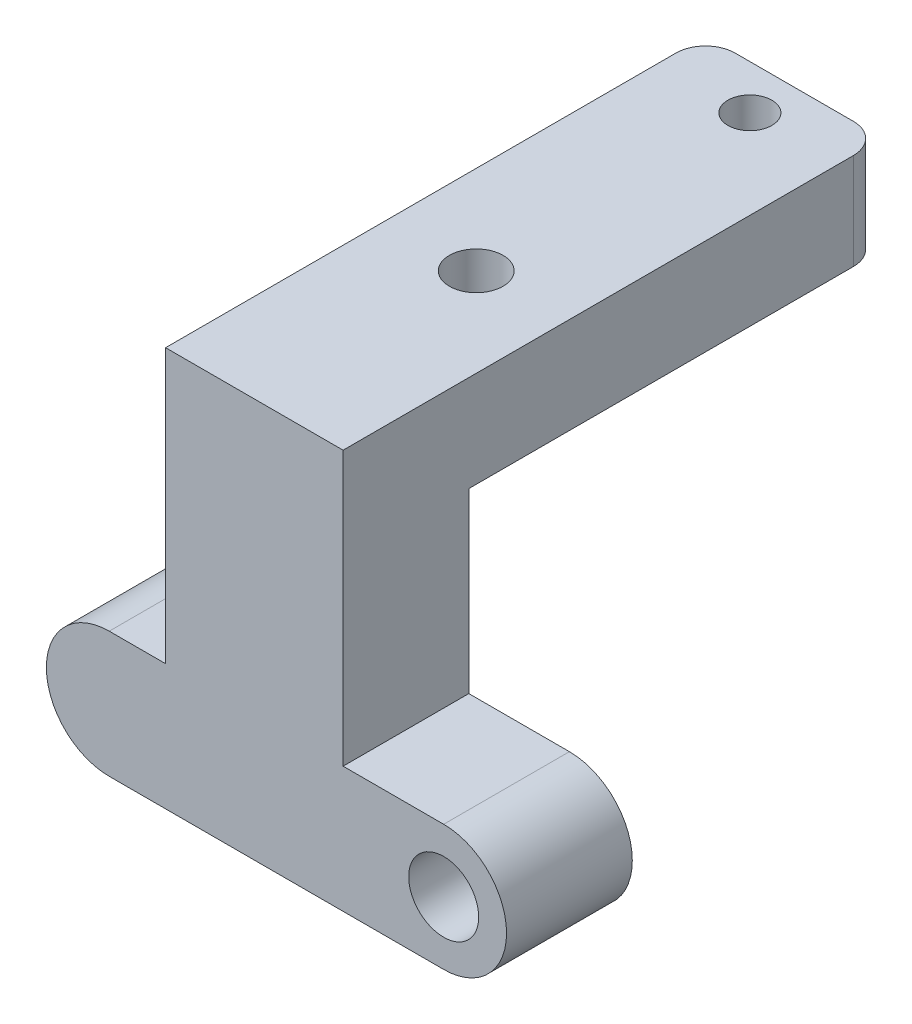
ISO-10303-21;
HEADER;
FILE_DESCRIPTION(('STEP AP214'),'2;1');
FILE_NAME('part.step','',(''),(''),'','','');
FILE_SCHEMA(('AUTOMOTIVE_DESIGN { 1 0 10303 214 1 1 1 1 }'));
ENDSEC;
DATA;
#1=APPLICATION_CONTEXT('core data for automotive mechanical design processes');
#2=APPLICATION_PROTOCOL_DEFINITION('international standard','automotive_design',2000,#1);
#3=PRODUCT_CONTEXT('',#1,'mechanical');
#4=PRODUCT('Part','Part','',(#3));
#5=PRODUCT_RELATED_PRODUCT_CATEGORY('part','',(#4));
#6=PRODUCT_DEFINITION_FORMATION('','',#4);
#7=PRODUCT_DEFINITION_CONTEXT('part definition',#1,'design');
#8=PRODUCT_DEFINITION('design','',#6,#7);
#9=PRODUCT_DEFINITION_SHAPE('','',#8);
#10=(LENGTH_UNIT() NAMED_UNIT(*) SI_UNIT(.MILLI.,.METRE.));
#11=(NAMED_UNIT(*) PLANE_ANGLE_UNIT() SI_UNIT($,.RADIAN.));
#12=(NAMED_UNIT(*) SI_UNIT($,.STERADIAN.) SOLID_ANGLE_UNIT());
#13=UNCERTAINTY_MEASURE_WITH_UNIT(LENGTH_MEASURE(1.E-05),#10,'distance_accuracy_value','');
#14=(GEOMETRIC_REPRESENTATION_CONTEXT(3) GLOBAL_UNCERTAINTY_ASSIGNED_CONTEXT((#13)) GLOBAL_UNIT_ASSIGNED_CONTEXT((#10,
#11,#12)) REPRESENTATION_CONTEXT('',''));
#15=CARTESIAN_POINT('',(0.,0.,0.));
#16=DIRECTION('',(0.,0.,1.));
#17=DIRECTION('',(1.,0.,0.));
#18=AXIS2_PLACEMENT_3D('',#15,#16,#17);
#19=CARTESIAN_POINT('',(4.03216256355221,0.,-8.5));
#20=DIRECTION('',(1.,0.,0.));
#21=DIRECTION('',(0.,0.,-1.));
#22=AXIS2_PLACEMENT_3D('',#19,#20,#21);
#23=PLANE('',#22);
#24=DIRECTION('',(0.,0.,1.));
#25=VECTOR('',#24,1.);
#26=CARTESIAN_POINT('',(4.03216256355221,16.25,-36.5));
#27=LINE('',#26,#25);
#28=CARTESIAN_POINT('',(4.03216256355221,16.25,-34.5));
#29=VERTEX_POINT('',#28);
#30=CARTESIAN_POINT('',(4.03216256355221,16.25,-8.5));
#31=VERTEX_POINT('',#30);
#32=EDGE_CURVE('E131',#29,#31,#27,.T.);
#33=ORIENTED_EDGE('',*,*,#32,.F.);
#34=DIRECTION('',(0.,1.,0.));
#35=VECTOR('',#34,1.);
#36=CARTESIAN_POINT('',(4.03216256355221,0.,-34.5));
#37=LINE('',#36,#35);
#38=CARTESIAN_POINT('',(4.03216256355221,22.75,-34.5));
#39=VERTEX_POINT('',#38);
#40=EDGE_CURVE('E11',#29,#39,#37,.T.);
#41=ORIENTED_EDGE('',*,*,#40,.T.);
#42=DIRECTION('',(0.,0.,1.));
#43=VECTOR('',#42,1.);
#44=CARTESIAN_POINT('',(4.03216256355221,22.75,-36.5));
#45=LINE('',#44,#43);
#46=CARTESIAN_POINT('',(4.03216256355221,22.75,0.));
#47=VERTEX_POINT('',#46);
#48=EDGE_CURVE('E124',#39,#47,#45,.T.);
#49=ORIENTED_EDGE('',*,*,#48,.T.);
#50=DIRECTION('',(0.,1.,0.));
#51=VECTOR('',#50,1.);
#52=CARTESIAN_POINT('',(4.03216256355221,0.,0.));
#53=LINE('',#52,#51);
#54=CARTESIAN_POINT('',(4.03216256355221,4.24999999999999,0.));
#55=VERTEX_POINT('',#54);
#56=EDGE_CURVE('E127',#55,#47,#53,.T.);
#57=ORIENTED_EDGE('',*,*,#56,.F.);
#58=DIRECTION('',(0.,0.,1.));
#59=VECTOR('',#58,1.);
#60=CARTESIAN_POINT('',(4.03216256355221,4.24999999999999,-8.5));
#61=LINE('',#60,#59);
#62=CARTESIAN_POINT('',(4.03216256355221,4.24999999999999,-8.5));
#63=VERTEX_POINT('',#62);
#64=EDGE_CURVE('E203',#63,#55,#61,.T.);
#65=ORIENTED_EDGE('',*,*,#64,.F.);
#66=DIRECTION('',(0.,1.,0.));
#67=VECTOR('',#66,1.);
#68=CARTESIAN_POINT('',(4.03216256355221,0.,-8.5));
#69=LINE('',#68,#67);
#70=EDGE_CURVE('E182',#63,#31,#69,.T.);
#71=ORIENTED_EDGE('',*,*,#70,.T.);
#72=EDGE_LOOP('',(#33,#41,#49,#57,#65,#71));
#73=FACE_BOUND('',#72,.T.);
#74=ADVANCED_FACE('F33',(#73),#23,.T.);
#75=CARTESIAN_POINT('',(0.,4.24999999999999,-8.5));
#76=DIRECTION('',(0.,1.,0.));
#77=DIRECTION('',(-1.,0.,0.));
#78=AXIS2_PLACEMENT_3D('',#75,#76,#77);
#79=PLANE('',#78);
#80=DIRECTION('',(-1.,0.,0.));
#81=VECTOR('',#80,1.);
#82=CARTESIAN_POINT('',(0.,4.24999999999999,0.));
#83=LINE('',#82,#81);
#84=CARTESIAN_POINT('',(10.8321625635522,4.25,0.));
#85=VERTEX_POINT('',#84);
#86=EDGE_CURVE('E142',#85,#55,#83,.T.);
#87=ORIENTED_EDGE('',*,*,#86,.F.);
#88=DIRECTION('',(0.,0.,1.));
#89=VECTOR('',#88,1.);
#90=CARTESIAN_POINT('',(10.8321625635522,4.25,-8.5));
#91=LINE('',#90,#89);
#92=CARTESIAN_POINT('',(10.8321625635522,4.25,-8.5));
#93=VERTEX_POINT('',#92);
#94=EDGE_CURVE('E206',#93,#85,#91,.T.);
#95=ORIENTED_EDGE('',*,*,#94,.F.);
#96=DIRECTION('',(-1.,0.,0.));
#97=VECTOR('',#96,1.);
#98=CARTESIAN_POINT('',(0.,4.24999999999999,-8.5));
#99=LINE('',#98,#97);
#100=EDGE_CURVE('E174',#93,#63,#99,.T.);
#101=ORIENTED_EDGE('',*,*,#100,.T.);
#102=ORIENTED_EDGE('',*,*,#64,.T.);
#103=EDGE_LOOP('',(#87,#95,#101,#102));
#104=FACE_BOUND('',#103,.T.);
#105=ADVANCED_FACE('F260',(#104),#79,.T.);
#106=CARTESIAN_POINT('',(10.8321625635522,0.,-8.5));
#107=DIRECTION('',(0.,0.,1.));
#108=DIRECTION('',(1.,0.,0.));
#109=AXIS2_PLACEMENT_3D('',#106,#107,#108);
#110=CYLINDRICAL_SURFACE('',#109,4.25);
#111=CARTESIAN_POINT('',(10.8321625635522,0.,0.));
#112=DIRECTION('',(0.,0.,1.));
#113=DIRECTION('',(1.,0.,0.));
#114=AXIS2_PLACEMENT_3D('',#111,#112,#113);
#115=CIRCLE('',#114,4.25);
#116=CARTESIAN_POINT('',(10.8321625635522,-4.25,0.));
#117=VERTEX_POINT('',#116);
#118=EDGE_CURVE('E199',#117,#85,#115,.T.);
#119=ORIENTED_EDGE('',*,*,#118,.F.);
#120=DIRECTION('',(0.,0.,1.));
#121=VECTOR('',#120,1.);
#122=CARTESIAN_POINT('',(10.8321625635522,-4.25,-8.5));
#123=LINE('',#122,#121);
#124=CARTESIAN_POINT('',(10.8321625635522,-4.25,-8.5));
#125=VERTEX_POINT('',#124);
#126=EDGE_CURVE('E208',#125,#117,#123,.T.);
#127=ORIENTED_EDGE('',*,*,#126,.F.);
#128=CARTESIAN_POINT('',(10.8321625635522,0.,-8.5));
#129=DIRECTION('',(0.,0.,1.));
#130=DIRECTION('',(1.,0.,0.));
#131=AXIS2_PLACEMENT_3D('',#128,#129,#130);
#132=CIRCLE('',#131,4.25);
#133=EDGE_CURVE('E179',#125,#93,#132,.T.);
#134=ORIENTED_EDGE('',*,*,#133,.T.);
#135=ORIENTED_EDGE('',*,*,#94,.T.);
#136=EDGE_LOOP('',(#119,#127,#134,#135));
#137=FACE_BOUND('',#136,.T.);
#138=ADVANCED_FACE('F257',(#137),#110,.T.);
#139=CARTESIAN_POINT('',(0.,-4.25,-8.5));
#140=DIRECTION('',(0.,1.,0.));
#141=DIRECTION('',(0.,0.,1.));
#142=AXIS2_PLACEMENT_3D('',#139,#140,#141);
#143=PLANE('',#142);
#144=DIRECTION('',(-1.,0.,0.));
#145=VECTOR('',#144,1.);
#146=CARTESIAN_POINT('',(0.,-4.25,0.));
#147=LINE('',#146,#145);
#148=CARTESIAN_POINT('',(-11.7760848591282,-4.25,0.));
#149=VERTEX_POINT('',#148);
#150=EDGE_CURVE('E196',#117,#149,#147,.T.);
#151=ORIENTED_EDGE('',*,*,#150,.T.);
#152=DIRECTION('',(0.,0.,1.));
#153=VECTOR('',#152,1.);
#154=CARTESIAN_POINT('',(-11.7760848591282,-4.25,-8.5));
#155=LINE('',#154,#153);
#156=CARTESIAN_POINT('',(-11.7760848591282,-4.25,-8.5));
#157=VERTEX_POINT('',#156);
#158=EDGE_CURVE('E210',#157,#149,#155,.T.);
#159=ORIENTED_EDGE('',*,*,#158,.F.);
#160=DIRECTION('',(-1.,0.,0.));
#161=VECTOR('',#160,1.);
#162=CARTESIAN_POINT('',(0.,-4.25,-8.5));
#163=LINE('',#162,#161);
#164=EDGE_CURVE('E177',#125,#157,#163,.T.);
#165=ORIENTED_EDGE('',*,*,#164,.F.);
#166=ORIENTED_EDGE('',*,*,#126,.T.);
#167=EDGE_LOOP('',(#151,#159,#165,#166));
#168=FACE_BOUND('',#167,.T.);
#169=ADVANCED_FACE('F267',(#168),#143,.F.);
#170=CARTESIAN_POINT('',(-11.7760848591282,0.,-8.5));
#171=DIRECTION('',(0.,0.,1.));
#172=DIRECTION('',(1.,0.,0.));
#173=AXIS2_PLACEMENT_3D('',#170,#171,#172);
#174=CYLINDRICAL_SURFACE('',#173,4.25);
#175=CARTESIAN_POINT('',(-11.7760848591282,0.,0.));
#176=DIRECTION('',(0.,0.,1.));
#177=DIRECTION('',(1.,0.,0.));
#178=AXIS2_PLACEMENT_3D('',#175,#176,#177);
#179=CIRCLE('',#178,4.25);
#180=CARTESIAN_POINT('',(-11.7760848591282,4.25,0.));
#181=VERTEX_POINT('',#180);
#182=EDGE_CURVE('E193',#181,#149,#179,.T.);
#183=ORIENTED_EDGE('',*,*,#182,.F.);
#184=DIRECTION('',(0.,0.,1.));
#185=VECTOR('',#184,1.);
#186=CARTESIAN_POINT('',(-11.7760848591282,4.25,-8.5));
#187=LINE('',#186,#185);
#188=CARTESIAN_POINT('',(-11.7760848591282,4.25,-8.5));
#189=VERTEX_POINT('',#188);
#190=EDGE_CURVE('E212',#189,#181,#187,.T.);
#191=ORIENTED_EDGE('',*,*,#190,.F.);
#192=CARTESIAN_POINT('',(-11.7760848591282,0.,-8.5));
#193=DIRECTION('',(0.,0.,1.));
#194=DIRECTION('',(1.,0.,0.));
#195=AXIS2_PLACEMENT_3D('',#192,#193,#194);
#196=CIRCLE('',#195,4.25);
#197=EDGE_CURVE('E173',#189,#157,#196,.T.);
#198=ORIENTED_EDGE('',*,*,#197,.T.);
#199=ORIENTED_EDGE('',*,*,#158,.T.);
#200=EDGE_LOOP('',(#183,#191,#198,#199));
#201=FACE_BOUND('',#200,.T.);
#202=ADVANCED_FACE('F251',(#201),#174,.T.);
#203=CARTESIAN_POINT('',(-7.96783743644779,4.25,0.));
#204=VERTEX_POINT('',#203);
#205=EDGE_CURVE('E190',#204,#181,#83,.T.);
#206=ORIENTED_EDGE('',*,*,#205,.F.);
#207=DIRECTION('',(0.,0.,1.));
#208=VECTOR('',#207,1.);
#209=CARTESIAN_POINT('',(-7.96783743644779,4.25,-8.5));
#210=LINE('',#209,#208);
#211=CARTESIAN_POINT('',(-7.96783743644779,4.25,-8.5));
#212=VERTEX_POINT('',#211);
#213=EDGE_CURVE('E188',#212,#204,#210,.T.);
#214=ORIENTED_EDGE('',*,*,#213,.F.);
#215=EDGE_CURVE('E170',#212,#189,#99,.T.);
#216=ORIENTED_EDGE('',*,*,#215,.T.);
#217=ORIENTED_EDGE('',*,*,#190,.T.);
#218=EDGE_LOOP('',(#206,#214,#216,#217));
#219=FACE_BOUND('',#218,.T.);
#220=ADVANCED_FACE('F248',(#219),#79,.T.);
#221=CARTESIAN_POINT('',(-7.96783743644779,0.,-8.5));
#222=DIRECTION('',(1.,0.,0.));
#223=DIRECTION('',(0.,0.,-1.));
#224=AXIS2_PLACEMENT_3D('',#221,#222,#223);
#225=PLANE('',#224);
#226=DIRECTION('',(0.,0.,1.));
#227=VECTOR('',#226,1.);
#228=CARTESIAN_POINT('',(-7.96783743644779,22.75,-36.5));
#229=LINE('',#228,#227);
#230=CARTESIAN_POINT('',(-7.96783743644779,22.75,-34.5));
#231=VERTEX_POINT('',#230);
#232=CARTESIAN_POINT('',(-7.96783743644779,22.75,0.));
#233=VERTEX_POINT('',#232);
#234=EDGE_CURVE('E130',#231,#233,#229,.T.);
#235=ORIENTED_EDGE('',*,*,#234,.F.);
#236=DIRECTION('',(0.,-1.,0.));
#237=VECTOR('',#236,1.);
#238=CARTESIAN_POINT('',(-7.96783743644779,16.25,-34.5));
#239=LINE('',#238,#237);
#240=CARTESIAN_POINT('',(-7.96783743644779,16.25,-34.5));
#241=VERTEX_POINT('',#240);
#242=EDGE_CURVE('E205',#231,#241,#239,.T.);
#243=ORIENTED_EDGE('',*,*,#242,.T.);
#244=DIRECTION('',(0.,0.,1.));
#245=VECTOR('',#244,1.);
#246=CARTESIAN_POINT('',(-7.96783743644779,16.25,-36.5));
#247=LINE('',#246,#245);
#248=CARTESIAN_POINT('',(-7.96783743644779,16.25,-8.5));
#249=VERTEX_POINT('',#248);
#250=EDGE_CURVE('E162',#241,#249,#247,.T.);
#251=ORIENTED_EDGE('',*,*,#250,.T.);
#252=DIRECTION('',(0.,1.,0.));
#253=VECTOR('',#252,1.);
#254=CARTESIAN_POINT('',(-7.96783743644779,0.,-8.5));
#255=LINE('',#254,#253);
#256=EDGE_CURVE('E167',#212,#249,#255,.T.);
#257=ORIENTED_EDGE('',*,*,#256,.F.);
#258=ORIENTED_EDGE('',*,*,#213,.T.);
#259=DIRECTION('',(0.,1.,0.));
#260=VECTOR('',#259,1.);
#261=CARTESIAN_POINT('',(-7.96783743644779,0.,0.));
#262=LINE('',#261,#260);
#263=EDGE_CURVE('E159',#204,#233,#262,.T.);
#264=ORIENTED_EDGE('',*,*,#263,.T.);
#265=EDGE_LOOP('',(#235,#243,#251,#257,#258,#264));
#266=FACE_BOUND('',#265,.T.);
#267=ADVANCED_FACE('F228',(#266),#225,.F.);
#268=CARTESIAN_POINT('',(10.8321625635522,0.,-8.5));
#269=DIRECTION('',(0.,0.,1.));
#270=DIRECTION('',(1.,0.,0.));
#271=AXIS2_PLACEMENT_3D('',#268,#269,#270);
#272=CYLINDRICAL_SURFACE('',#271,2.36597938144329);
#273=CARTESIAN_POINT('',(10.8321625635522,0.,-8.5));
#274=DIRECTION('',(0.,0.,1.));
#275=DIRECTION('',(1.,0.,0.));
#276=AXIS2_PLACEMENT_3D('',#273,#274,#275);
#277=CIRCLE('',#276,2.36597938144329);
#278=CARTESIAN_POINT('',(13.1981419449955,0.,-8.5));
#279=VERTEX_POINT('',#278);
#280=EDGE_CURVE('E185',#279,#279,#277,.T.);
#281=ORIENTED_EDGE('',*,*,#280,.F.);
#282=EDGE_LOOP('',(#281));
#283=FACE_BOUND('',#282,.T.);
#284=CARTESIAN_POINT('',(10.8321625635522,0.,0.));
#285=DIRECTION('',(0.,0.,1.));
#286=DIRECTION('',(1.,0.,0.));
#287=AXIS2_PLACEMENT_3D('',#284,#285,#286);
#288=CIRCLE('',#287,2.36597938144329);
#289=CARTESIAN_POINT('',(13.1981419449955,0.,0.));
#290=VERTEX_POINT('',#289);
#291=EDGE_CURVE('E143',#290,#290,#288,.T.);
#292=ORIENTED_EDGE('',*,*,#291,.T.);
#293=EDGE_LOOP('',(#292));
#294=FACE_BOUND('',#293,.T.);
#295=ADVANCED_FACE('F275',(#283,#294),#272,.F.);
#296=CARTESIAN_POINT('',(0.,0.,-8.5));
#297=DIRECTION('',(0.,0.,1.));
#298=DIRECTION('',(1.,0.,0.));
#299=AXIS2_PLACEMENT_3D('',#296,#297,#298);
#300=PLANE('',#299);
#301=DIRECTION('',(1.,0.,0.));
#302=VECTOR('',#301,1.);
#303=CARTESIAN_POINT('',(0.,16.25,-8.5));
#304=LINE('',#303,#302);
#305=EDGE_CURVE('E164',#249,#31,#304,.T.);
#306=ORIENTED_EDGE('',*,*,#305,.T.);
#307=ORIENTED_EDGE('',*,*,#70,.F.);
#308=ORIENTED_EDGE('',*,*,#100,.F.);
#309=ORIENTED_EDGE('',*,*,#133,.F.);
#310=ORIENTED_EDGE('',*,*,#164,.T.);
#311=ORIENTED_EDGE('',*,*,#197,.F.);
#312=ORIENTED_EDGE('',*,*,#215,.F.);
#313=ORIENTED_EDGE('',*,*,#256,.T.);
#314=EDGE_LOOP('',(#306,#307,#308,#309,#310,#311,#312,#313));
#315=FACE_BOUND('',#314,.T.);
#316=ORIENTED_EDGE('',*,*,#280,.T.);
#317=EDGE_LOOP('',(#316));
#318=FACE_BOUND('',#317,.T.);
#319=ADVANCED_FACE('F240',(#315,#318),#300,.F.);
#320=CARTESIAN_POINT('',(0.,0.,0.));
#321=DIRECTION('',(0.,0.,1.));
#322=DIRECTION('',(1.,0.,0.));
#323=AXIS2_PLACEMENT_3D('',#320,#321,#322);
#324=PLANE('',#323);
#325=ORIENTED_EDGE('',*,*,#56,.T.);
#326=DIRECTION('',(-1.,0.,0.));
#327=VECTOR('',#326,1.);
#328=CARTESIAN_POINT('',(-7.96783743644779,22.75,0.));
#329=LINE('',#328,#327);
#330=EDGE_CURVE('E139',#47,#233,#329,.T.);
#331=ORIENTED_EDGE('',*,*,#330,.T.);
#332=ORIENTED_EDGE('',*,*,#263,.F.);
#333=ORIENTED_EDGE('',*,*,#205,.T.);
#334=ORIENTED_EDGE('',*,*,#182,.T.);
#335=ORIENTED_EDGE('',*,*,#150,.F.);
#336=ORIENTED_EDGE('',*,*,#118,.T.);
#337=ORIENTED_EDGE('',*,*,#86,.T.);
#338=EDGE_LOOP('',(#325,#331,#332,#333,#334,#335,#336,#337));
#339=FACE_BOUND('',#338,.T.);
#340=ORIENTED_EDGE('',*,*,#291,.F.);
#341=EDGE_LOOP('',(#340));
#342=FACE_BOUND('',#341,.T.);
#343=ADVANCED_FACE('F136',(#339,#342),#324,.T.);
#344=CARTESIAN_POINT('',(-7.96783743644779,16.25,-36.5));
#345=DIRECTION('',(0.,-1.,0.));
#346=DIRECTION('',(0.,0.,-1.));
#347=AXIS2_PLACEMENT_3D('',#344,#345,#346);
#348=PLANE('',#347);
#349=CARTESIAN_POINT('',(-1.96783743644779,16.25,-33.5));
#350=DIRECTION('',(0.,-1.,0.));
#351=DIRECTION('',(0.,0.,-1.));
#352=AXIS2_PLACEMENT_3D('',#349,#350,#351);
#353=CIRCLE('',#352,1.48381405825439);
#354=CARTESIAN_POINT('',(-1.96783743644779,16.25,-34.9838140582544));
#355=VERTEX_POINT('',#354);
#356=EDGE_CURVE('E149',#355,#355,#353,.T.);
#357=ORIENTED_EDGE('',*,*,#356,.F.);
#358=EDGE_LOOP('',(#357));
#359=FACE_BOUND('',#358,.T.);
#360=CARTESIAN_POINT('',(-1.96783743644779,16.25,-15.));
#361=DIRECTION('',(0.,-1.,0.));
#362=DIRECTION('',(0.,0.,-1.));
#363=AXIS2_PLACEMENT_3D('',#360,#361,#362);
#364=CIRCLE('',#363,1.81386094892881);
#365=CARTESIAN_POINT('',(-1.96783743644779,16.25,-16.8138609489288));
#366=VERTEX_POINT('',#365);
#367=EDGE_CURVE('E155',#366,#366,#364,.T.);
#368=ORIENTED_EDGE('',*,*,#367,.F.);
#369=EDGE_LOOP('',(#368));
#370=FACE_BOUND('',#369,.T.);
#371=ORIENTED_EDGE('',*,*,#250,.F.);
#372=CARTESIAN_POINT('',(-5.96783743644779,16.25,-34.5));
#373=DIRECTION('',(0.,-1.,0.));
#374=DIRECTION('',(0.,0.,-1.));
#375=AXIS2_PLACEMENT_3D('',#372,#373,#374);
#376=CIRCLE('',#375,2.);
#377=CARTESIAN_POINT('',(-5.96783743644779,16.25,-36.5));
#378=VERTEX_POINT('',#377);
#379=EDGE_CURVE('E219',#241,#378,#376,.T.);
#380=ORIENTED_EDGE('',*,*,#379,.T.);
#381=DIRECTION('',(1.,0.,0.));
#382=VECTOR('',#381,1.);
#383=CARTESIAN_POINT('',(-7.96783743644779,16.25,-36.5));
#384=LINE('',#383,#382);
#385=CARTESIAN_POINT('',(2.03216256355221,16.25,-36.5));
#386=VERTEX_POINT('',#385);
#387=EDGE_CURVE('E148',#378,#386,#384,.T.);
#388=ORIENTED_EDGE('',*,*,#387,.T.);
#389=CARTESIAN_POINT('',(2.03216256355221,16.25,-34.5));
#390=DIRECTION('',(0.,-1.,0.));
#391=DIRECTION('',(0.,0.,-1.));
#392=AXIS2_PLACEMENT_3D('',#389,#390,#391);
#393=CIRCLE('',#392,2.);
#394=EDGE_CURVE('E217',#386,#29,#393,.T.);
#395=ORIENTED_EDGE('',*,*,#394,.T.);
#396=ORIENTED_EDGE('',*,*,#32,.T.);
#397=ORIENTED_EDGE('',*,*,#305,.F.);
#398=EDGE_LOOP('',(#371,#380,#388,#395,#396,#397));
#399=FACE_BOUND('',#398,.T.);
#400=ADVANCED_FACE('F232',(#359,#370,#399),#348,.T.);
#401=CARTESIAN_POINT('',(-7.96783743644779,22.75,-36.5));
#402=DIRECTION('',(0.,1.,0.));
#403=DIRECTION('',(0.,0.,1.));
#404=AXIS2_PLACEMENT_3D('',#401,#402,#403);
#405=PLANE('',#404);
#406=CARTESIAN_POINT('',(-1.96783743644779,22.75,-33.5));
#407=DIRECTION('',(0.,1.,0.));
#408=DIRECTION('',(0.,0.,1.));
#409=AXIS2_PLACEMENT_3D('',#406,#407,#408);
#410=CIRCLE('',#409,1.48381405825439);
#411=CARTESIAN_POINT('',(-1.96783743644779,22.75,-32.0161859417456));
#412=VERTEX_POINT('',#411);
#413=EDGE_CURVE('E438',#412,#412,#410,.T.);
#414=ORIENTED_EDGE('',*,*,#413,.F.);
#415=EDGE_LOOP('',(#414));
#416=FACE_BOUND('',#415,.T.);
#417=CARTESIAN_POINT('',(-1.96783743644779,22.75,-15.));
#418=DIRECTION('',(0.,1.,0.));
#419=DIRECTION('',(0.,0.,1.));
#420=AXIS2_PLACEMENT_3D('',#417,#418,#419);
#421=CIRCLE('',#420,1.81386094892881);
#422=CARTESIAN_POINT('',(-1.96783743644779,22.75,-13.1861390510712));
#423=VERTEX_POINT('',#422);
#424=EDGE_CURVE('E441',#423,#423,#421,.T.);
#425=ORIENTED_EDGE('',*,*,#424,.F.);
#426=EDGE_LOOP('',(#425));
#427=FACE_BOUND('',#426,.T.);
#428=DIRECTION('',(-1.,0.,0.));
#429=VECTOR('',#428,1.);
#430=CARTESIAN_POINT('',(-7.96783743644779,22.75,-36.5));
#431=LINE('',#430,#429);
#432=CARTESIAN_POINT('',(2.03216256355221,22.75,-36.5));
#433=VERTEX_POINT('',#432);
#434=CARTESIAN_POINT('',(-5.96783743644779,22.75,-36.5));
#435=VERTEX_POINT('',#434);
#436=EDGE_CURVE('E152',#433,#435,#431,.T.);
#437=ORIENTED_EDGE('',*,*,#436,.T.);
#438=CARTESIAN_POINT('',(-5.96783743644779,22.75,-34.5));
#439=DIRECTION('',(0.,1.,0.));
#440=DIRECTION('',(0.,0.,1.));
#441=AXIS2_PLACEMENT_3D('',#438,#439,#440);
#442=CIRCLE('',#441,2.);
#443=EDGE_CURVE('E41',#435,#231,#442,.T.);
#444=ORIENTED_EDGE('',*,*,#443,.T.);
#445=ORIENTED_EDGE('',*,*,#234,.T.);
#446=ORIENTED_EDGE('',*,*,#330,.F.);
#447=ORIENTED_EDGE('',*,*,#48,.F.);
#448=CARTESIAN_POINT('',(2.03216256355221,22.75,-34.5));
#449=DIRECTION('',(0.,1.,0.));
#450=DIRECTION('',(0.,0.,1.));
#451=AXIS2_PLACEMENT_3D('',#448,#449,#450);
#452=CIRCLE('',#451,2.);
#453=EDGE_CURVE('E48',#39,#433,#452,.T.);
#454=ORIENTED_EDGE('',*,*,#453,.T.);
#455=EDGE_LOOP('',(#437,#444,#445,#446,#447,#454));
#456=FACE_BOUND('',#455,.T.);
#457=ADVANCED_FACE('F145',(#416,#427,#456),#405,.T.);
#458=CARTESIAN_POINT('',(0.,0.,-36.5));
#459=DIRECTION('',(0.,0.,-1.));
#460=DIRECTION('',(-1.,0.,0.));
#461=AXIS2_PLACEMENT_3D('',#458,#459,#460);
#462=PLANE('',#461);
#463=ORIENTED_EDGE('',*,*,#387,.F.);
#464=DIRECTION('',(0.,-1.,0.));
#465=VECTOR('',#464,1.);
#466=CARTESIAN_POINT('',(-5.96783743644779,22.75,-36.5));
#467=LINE('',#466,#465);
#468=EDGE_CURVE('E55',#378,#435,#467,.F.);
#469=ORIENTED_EDGE('',*,*,#468,.T.);
#470=ORIENTED_EDGE('',*,*,#436,.F.);
#471=DIRECTION('',(0.,1.,0.));
#472=VECTOR('',#471,1.);
#473=CARTESIAN_POINT('',(2.03216256355221,0.,-36.5));
#474=LINE('',#473,#472);
#475=EDGE_CURVE('E221',#433,#386,#474,.F.);
#476=ORIENTED_EDGE('',*,*,#475,.T.);
#477=EDGE_LOOP('',(#463,#469,#470,#476));
#478=FACE_BOUND('',#477,.T.);
#479=ADVANCED_FACE('F235',(#478),#462,.T.);
#480=CARTESIAN_POINT('',(-1.96783743644779,-4.25,-15.));
#481=DIRECTION('',(0.,1.,0.));
#482=DIRECTION('',(0.,0.,1.));
#483=AXIS2_PLACEMENT_3D('',#480,#481,#482);
#484=CYLINDRICAL_SURFACE('',#483,1.81386094892881);
#485=ORIENTED_EDGE('',*,*,#367,.T.);
#486=EDGE_LOOP('',(#485));
#487=FACE_BOUND('',#486,.T.);
#488=ORIENTED_EDGE('',*,*,#424,.T.);
#489=EDGE_LOOP('',(#488));
#490=FACE_BOUND('',#489,.T.);
#491=ADVANCED_FACE('F288',(#487,#490),#484,.F.);
#492=CARTESIAN_POINT('',(-1.96783743644779,-4.25,-33.5));
#493=DIRECTION('',(0.,1.,0.));
#494=DIRECTION('',(0.,0.,1.));
#495=AXIS2_PLACEMENT_3D('',#492,#493,#494);
#496=CYLINDRICAL_SURFACE('',#495,1.48381405825439);
#497=ORIENTED_EDGE('',*,*,#356,.T.);
#498=EDGE_LOOP('',(#497));
#499=FACE_BOUND('',#498,.T.);
#500=ORIENTED_EDGE('',*,*,#413,.T.);
#501=EDGE_LOOP('',(#500));
#502=FACE_BOUND('',#501,.T.);
#503=ADVANCED_FACE('F283',(#499,#502),#496,.F.);
#504=CARTESIAN_POINT('',(-5.96783743644779,0.,-34.5));
#505=DIRECTION('',(0.,1.,0.));
#506=DIRECTION('',(0.,0.,1.));
#507=AXIS2_PLACEMENT_3D('',#504,#505,#506);
#508=CYLINDRICAL_SURFACE('',#507,2.);
#509=ORIENTED_EDGE('',*,*,#443,.F.);
#510=ORIENTED_EDGE('',*,*,#468,.F.);
#511=ORIENTED_EDGE('',*,*,#379,.F.);
#512=ORIENTED_EDGE('',*,*,#242,.F.);
#513=EDGE_LOOP('',(#509,#510,#511,#512));
#514=FACE_BOUND('',#513,.T.);
#515=ADVANCED_FACE('F230',(#514),#508,.T.);
#516=CARTESIAN_POINT('',(2.03216256355221,0.,-34.5));
#517=DIRECTION('',(0.,1.,0.));
#518=DIRECTION('',(0.,0.,1.));
#519=AXIS2_PLACEMENT_3D('',#516,#517,#518);
#520=CYLINDRICAL_SURFACE('',#519,2.);
#521=ORIENTED_EDGE('',*,*,#394,.F.);
#522=ORIENTED_EDGE('',*,*,#475,.F.);
#523=ORIENTED_EDGE('',*,*,#453,.F.);
#524=ORIENTED_EDGE('',*,*,#40,.F.);
#525=EDGE_LOOP('',(#521,#522,#523,#524));
#526=FACE_BOUND('',#525,.T.);
#527=ADVANCED_FACE('F35',(#526),#520,.T.);
#528=CLOSED_SHELL('',(#74,#105,#138,#169,#202,#220,#267,#295,#319,#343,#400,#457,#479,#491,#503,
#515,#527));
#529=MANIFOLD_SOLID_BREP('B2',#528);
#530=ADVANCED_BREP_SHAPE_REPRESENTATION('',(#18,#529),#14);
#531=SHAPE_DEFINITION_REPRESENTATION(#9,#530);
ENDSEC;
END-ISO-10303-21;
